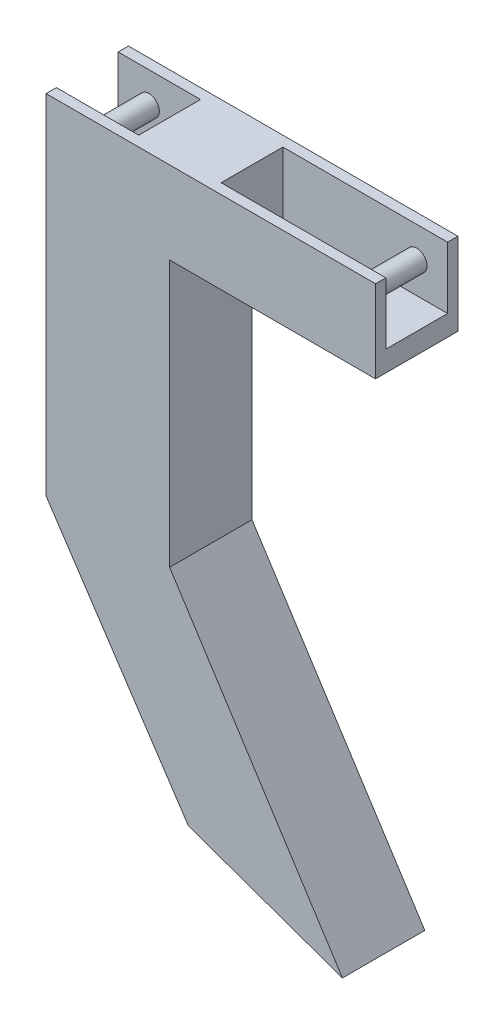
ISO-10303-21;
HEADER;
FILE_DESCRIPTION(('STEP AP214'),'2;1');
FILE_NAME('part.step','',(''),(''),'','','');
FILE_SCHEMA(('AUTOMOTIVE_DESIGN { 1 0 10303 214 1 1 1 1 }'));
ENDSEC;
DATA;
#1=APPLICATION_CONTEXT('core data for automotive mechanical design processes');
#2=APPLICATION_PROTOCOL_DEFINITION('international standard','automotive_design',2000,#1);
#3=PRODUCT_CONTEXT('',#1,'mechanical');
#4=PRODUCT('Part','Part','',(#3));
#5=PRODUCT_RELATED_PRODUCT_CATEGORY('part','',(#4));
#6=PRODUCT_DEFINITION_FORMATION('','',#4);
#7=PRODUCT_DEFINITION_CONTEXT('part definition',#1,'design');
#8=PRODUCT_DEFINITION('design','',#6,#7);
#9=PRODUCT_DEFINITION_SHAPE('','',#8);
#10=(LENGTH_UNIT() NAMED_UNIT(*) SI_UNIT(.MILLI.,.METRE.));
#11=(NAMED_UNIT(*) PLANE_ANGLE_UNIT() SI_UNIT($,.RADIAN.));
#12=(NAMED_UNIT(*) SI_UNIT($,.STERADIAN.) SOLID_ANGLE_UNIT());
#13=UNCERTAINTY_MEASURE_WITH_UNIT(LENGTH_MEASURE(1.E-05),#10,'distance_accuracy_value','');
#14=(GEOMETRIC_REPRESENTATION_CONTEXT(3) GLOBAL_UNCERTAINTY_ASSIGNED_CONTEXT((#13)) GLOBAL_UNIT_ASSIGNED_CONTEXT((#10,
#11,#12)) REPRESENTATION_CONTEXT('',''));
#15=CARTESIAN_POINT('',(0.,0.,0.));
#16=DIRECTION('',(0.,0.,1.));
#17=DIRECTION('',(1.,0.,0.));
#18=AXIS2_PLACEMENT_3D('',#15,#16,#17);
#19=CARTESIAN_POINT('',(26.6666666666667,32.2153846153846,35.));
#20=DIRECTION('',(0.,0.,1.));
#21=DIRECTION('',(1.,0.,0.));
#22=AXIS2_PLACEMENT_3D('',#19,#20,#21);
#23=PLANE('',#22);
#24=DIRECTION('',(1.,0.,0.));
#25=VECTOR('',#24,1.);
#26=CARTESIAN_POINT('',(26.6666666666667,62.2153846153846,35.));
#27=LINE('',#26,#25);
#28=CARTESIAN_POINT('',(26.6666666666667,62.2153846153846,35.));
#29=VERTEX_POINT('',#28);
#30=CARTESIAN_POINT('',(106.666666666667,62.2153846153846,35.));
#31=VERTEX_POINT('',#30);
#32=EDGE_CURVE('E169',#29,#31,#27,.T.);
#33=ORIENTED_EDGE('',*,*,#32,.T.);
#34=DIRECTION('',(0.,1.,0.));
#35=VECTOR('',#34,1.);
#36=CARTESIAN_POINT('',(106.666666666667,32.2153846153846,35.));
#37=LINE('',#36,#35);
#38=CARTESIAN_POINT('',(106.666666666667,32.2153846153846,35.));
#39=VERTEX_POINT('',#38);
#40=EDGE_CURVE('E195',#39,#31,#37,.T.);
#41=ORIENTED_EDGE('',*,*,#40,.F.);
#42=DIRECTION('',(1.,0.,0.));
#43=VECTOR('',#42,1.);
#44=CARTESIAN_POINT('',(26.6666666666667,32.2153846153846,35.));
#45=LINE('',#44,#43);
#46=CARTESIAN_POINT('',(26.6666666666667,32.2153846153846,35.));
#47=VERTEX_POINT('',#46);
#48=EDGE_CURVE('E166',#47,#39,#45,.T.);
#49=ORIENTED_EDGE('',*,*,#48,.F.);
#50=DIRECTION('',(0.,1.,0.));
#51=VECTOR('',#50,1.);
#52=CARTESIAN_POINT('',(26.6666666666667,32.2153846153846,35.));
#53=LINE('',#52,#51);
#54=EDGE_CURVE('E176',#47,#29,#53,.T.);
#55=ORIENTED_EDGE('',*,*,#54,.T.);
#56=EDGE_LOOP('',(#33,#41,#49,#55));
#57=FACE_BOUND('',#56,.T.);
#58=CARTESIAN_POINT('',(91.6666666666667,47.2153846153846,35.));
#59=DIRECTION('',(0.,0.,1.));
#60=DIRECTION('',(1.,0.,0.));
#61=AXIS2_PLACEMENT_3D('',#58,#59,#60);
#62=CIRCLE('',#61,5.00000000000001);
#63=CARTESIAN_POINT('',(96.6666666666667,47.2153846153846,35.));
#64=VERTEX_POINT('',#63);
#65=EDGE_CURVE('E11',#64,#64,#62,.F.);
#66=ORIENTED_EDGE('',*,*,#65,.F.);
#67=EDGE_LOOP('',(#66));
#68=FACE_BOUND('',#67,.T.);
#69=ADVANCED_FACE('F38',(#57,#68),#23,.F.);
#70=CARTESIAN_POINT('',(26.6666666666667,32.2153846153846,5.));
#71=DIRECTION('',(0.,0.,-1.));
#72=DIRECTION('',(-1.,0.,0.));
#73=AXIS2_PLACEMENT_3D('',#70,#71,#72);
#74=PLANE('',#73);
#75=DIRECTION('',(-1.,0.,0.));
#76=VECTOR('',#75,1.);
#77=CARTESIAN_POINT('',(26.6666666666667,62.2153846153846,5.));
#78=LINE('',#77,#76);
#79=CARTESIAN_POINT('',(106.666666666667,62.2153846153846,5.));
#80=VERTEX_POINT('',#79);
#81=CARTESIAN_POINT('',(26.6666666666667,62.2153846153846,5.));
#82=VERTEX_POINT('',#81);
#83=EDGE_CURVE('E368',#80,#82,#78,.T.);
#84=ORIENTED_EDGE('',*,*,#83,.T.);
#85=DIRECTION('',(0.,1.,0.));
#86=VECTOR('',#85,1.);
#87=CARTESIAN_POINT('',(26.6666666666667,32.2153846153846,5.));
#88=LINE('',#87,#86);
#89=CARTESIAN_POINT('',(26.6666666666667,32.2153846153846,5.));
#90=VERTEX_POINT('',#89);
#91=EDGE_CURVE('E155',#90,#82,#88,.T.);
#92=ORIENTED_EDGE('',*,*,#91,.F.);
#93=DIRECTION('',(-1.,0.,0.));
#94=VECTOR('',#93,1.);
#95=CARTESIAN_POINT('',(26.6666666666667,32.2153846153846,5.));
#96=LINE('',#95,#94);
#97=CARTESIAN_POINT('',(106.666666666667,32.2153846153846,5.));
#98=VERTEX_POINT('',#97);
#99=EDGE_CURVE('E151',#98,#90,#96,.T.);
#100=ORIENTED_EDGE('',*,*,#99,.F.);
#101=DIRECTION('',(0.,1.,0.));
#102=VECTOR('',#101,1.);
#103=CARTESIAN_POINT('',(106.666666666667,32.2153846153846,5.));
#104=LINE('',#103,#102);
#105=EDGE_CURVE('E53',#98,#80,#104,.T.);
#106=ORIENTED_EDGE('',*,*,#105,.T.);
#107=EDGE_LOOP('',(#84,#92,#100,#106));
#108=FACE_BOUND('',#107,.T.);
#109=CARTESIAN_POINT('',(91.6666666666667,47.2153846153846,5.));
#110=DIRECTION('',(0.,0.,-1.));
#111=DIRECTION('',(-1.,0.,0.));
#112=AXIS2_PLACEMENT_3D('',#109,#110,#111);
#113=CIRCLE('',#112,5.00000000000001);
#114=CARTESIAN_POINT('',(86.6666666666667,47.2153846153846,5.));
#115=VERTEX_POINT('',#114);
#116=EDGE_CURVE('E46',#115,#115,#113,.F.);
#117=ORIENTED_EDGE('',*,*,#116,.F.);
#118=EDGE_LOOP('',(#117));
#119=FACE_BOUND('',#118,.T.);
#120=ADVANCED_FACE('F153',(#108,#119),#74,.F.);
#121=CARTESIAN_POINT('',(-53.3333333333333,32.2153846153846,35.));
#122=DIRECTION('',(0.,0.,1.));
#123=DIRECTION('',(1.,0.,0.));
#124=AXIS2_PLACEMENT_3D('',#121,#122,#123);
#125=PLANE('',#124);
#126=DIRECTION('',(1.,0.,0.));
#127=VECTOR('',#126,1.);
#128=CARTESIAN_POINT('',(-53.3333333333333,62.2153846153846,35.));
#129=LINE('',#128,#127);
#130=CARTESIAN_POINT('',(-53.3333333333333,62.2153846153846,35.));
#131=VERTEX_POINT('',#130);
#132=CARTESIAN_POINT('',(-13.3333333333333,62.2153846153846,35.));
#133=VERTEX_POINT('',#132);
#134=EDGE_CURVE('E183',#131,#133,#129,.T.);
#135=ORIENTED_EDGE('',*,*,#134,.T.);
#136=DIRECTION('',(0.,1.,0.));
#137=VECTOR('',#136,1.);
#138=CARTESIAN_POINT('',(-13.3333333333333,32.2153846153846,35.));
#139=LINE('',#138,#137);
#140=CARTESIAN_POINT('',(-13.3333333333333,32.2153846153846,35.));
#141=VERTEX_POINT('',#140);
#142=EDGE_CURVE('E199',#141,#133,#139,.T.);
#143=ORIENTED_EDGE('',*,*,#142,.F.);
#144=DIRECTION('',(1.,0.,0.));
#145=VECTOR('',#144,1.);
#146=CARTESIAN_POINT('',(-53.3333333333333,32.2153846153846,35.));
#147=LINE('',#146,#145);
#148=CARTESIAN_POINT('',(-53.3333333333333,32.2153846153846,35.));
#149=VERTEX_POINT('',#148);
#150=EDGE_CURVE('E187',#149,#141,#147,.T.);
#151=ORIENTED_EDGE('',*,*,#150,.F.);
#152=DIRECTION('',(0.,1.,0.));
#153=VECTOR('',#152,1.);
#154=CARTESIAN_POINT('',(-53.3333333333333,32.2153846153846,35.));
#155=LINE('',#154,#153);
#156=EDGE_CURVE('E202',#149,#131,#155,.T.);
#157=ORIENTED_EDGE('',*,*,#156,.T.);
#158=EDGE_LOOP('',(#135,#143,#151,#157));
#159=FACE_BOUND('',#158,.T.);
#160=CARTESIAN_POINT('',(-38.3333333333333,47.2153846153846,35.));
#161=DIRECTION('',(0.,0.,1.));
#162=DIRECTION('',(1.,0.,0.));
#163=AXIS2_PLACEMENT_3D('',#160,#161,#162);
#164=CIRCLE('',#163,5.);
#165=CARTESIAN_POINT('',(-33.3333333333333,47.2153846153846,35.));
#166=VERTEX_POINT('',#165);
#167=EDGE_CURVE('E270',#166,#166,#164,.F.);
#168=ORIENTED_EDGE('',*,*,#167,.F.);
#169=EDGE_LOOP('',(#168));
#170=FACE_BOUND('',#169,.T.);
#171=ADVANCED_FACE('F277',(#159,#170),#125,.F.);
#172=CARTESIAN_POINT('',(-53.3333333333333,32.2153846153846,5.00000000000001));
#173=DIRECTION('',(0.,0.,-1.));
#174=DIRECTION('',(-1.,0.,0.));
#175=AXIS2_PLACEMENT_3D('',#172,#173,#174);
#176=PLANE('',#175);
#177=DIRECTION('',(-1.,0.,0.));
#178=VECTOR('',#177,1.);
#179=CARTESIAN_POINT('',(-53.3333333333333,62.2153846153846,5.00000000000001));
#180=LINE('',#179,#178);
#181=CARTESIAN_POINT('',(-13.3333333333333,62.2153846153846,5.00000000000001));
#182=VERTEX_POINT('',#181);
#183=CARTESIAN_POINT('',(-53.3333333333333,62.2153846153846,5.00000000000001));
#184=VERTEX_POINT('',#183);
#185=EDGE_CURVE('E194',#182,#184,#180,.T.);
#186=ORIENTED_EDGE('',*,*,#185,.T.);
#187=DIRECTION('',(0.,1.,0.));
#188=VECTOR('',#187,1.);
#189=CARTESIAN_POINT('',(-53.3333333333333,32.2153846153846,5.00000000000001));
#190=LINE('',#189,#188);
#191=CARTESIAN_POINT('',(-53.3333333333333,32.2153846153846,5.00000000000001));
#192=VERTEX_POINT('',#191);
#193=EDGE_CURVE('E204',#192,#184,#190,.T.);
#194=ORIENTED_EDGE('',*,*,#193,.F.);
#195=DIRECTION('',(-1.,0.,0.));
#196=VECTOR('',#195,1.);
#197=CARTESIAN_POINT('',(-53.3333333333333,32.2153846153846,5.00000000000001));
#198=LINE('',#197,#196);
#199=CARTESIAN_POINT('',(-13.3333333333333,32.2153846153846,5.00000000000001));
#200=VERTEX_POINT('',#199);
#201=EDGE_CURVE('E61',#200,#192,#198,.T.);
#202=ORIENTED_EDGE('',*,*,#201,.F.);
#203=DIRECTION('',(0.,1.,0.));
#204=VECTOR('',#203,1.);
#205=CARTESIAN_POINT('',(-13.3333333333333,32.2153846153846,5.00000000000001));
#206=LINE('',#205,#204);
#207=EDGE_CURVE('E190',#200,#182,#206,.T.);
#208=ORIENTED_EDGE('',*,*,#207,.T.);
#209=EDGE_LOOP('',(#186,#194,#202,#208));
#210=FACE_BOUND('',#209,.T.);
#211=CARTESIAN_POINT('',(-38.3333333333333,47.2153846153846,5.00000000000001));
#212=DIRECTION('',(0.,0.,-1.));
#213=DIRECTION('',(-1.,0.,0.));
#214=AXIS2_PLACEMENT_3D('',#211,#212,#213);
#215=CIRCLE('',#214,5.);
#216=CARTESIAN_POINT('',(-43.3333333333333,47.2153846153846,5.00000000000001));
#217=VERTEX_POINT('',#216);
#218=EDGE_CURVE('E267',#217,#217,#215,.F.);
#219=ORIENTED_EDGE('',*,*,#218,.F.);
#220=EDGE_LOOP('',(#219));
#221=FACE_BOUND('',#220,.T.);
#222=ADVANCED_FACE('F283',(#210,#221),#176,.F.);
#223=CARTESIAN_POINT('',(6.66666666666667,22.2153846153846,40.));
#224=DIRECTION('',(0.,1.,0.));
#225=DIRECTION('',(-1.,0.,0.));
#226=AXIS2_PLACEMENT_3D('',#223,#224,#225);
#227=PLANE('',#226);
#228=DIRECTION('',(1.,0.,0.));
#229=VECTOR('',#228,1.);
#230=CARTESIAN_POINT('',(6.66666666666667,22.2153846153846,0.));
#231=LINE('',#230,#229);
#232=CARTESIAN_POINT('',(6.66666666666667,22.2153846153846,0.));
#233=VERTEX_POINT('',#232);
#234=CARTESIAN_POINT('',(106.666666666667,22.2153846153846,0.));
#235=VERTEX_POINT('',#234);
#236=EDGE_CURVE('E201',#233,#235,#231,.T.);
#237=ORIENTED_EDGE('',*,*,#236,.T.);
#238=DIRECTION('',(0.,0.,-1.));
#239=VECTOR('',#238,1.);
#240=CARTESIAN_POINT('',(106.666666666667,22.2153846153846,40.));
#241=LINE('',#240,#239);
#242=CARTESIAN_POINT('',(106.666666666667,22.2153846153846,40.));
#243=VERTEX_POINT('',#242);
#244=EDGE_CURVE('E264',#243,#235,#241,.T.);
#245=ORIENTED_EDGE('',*,*,#244,.F.);
#246=DIRECTION('',(1.,0.,0.));
#247=VECTOR('',#246,1.);
#248=CARTESIAN_POINT('',(6.66666666666667,22.2153846153846,40.));
#249=LINE('',#248,#247);
#250=CARTESIAN_POINT('',(6.66666666666667,22.2153846153846,40.));
#251=VERTEX_POINT('',#250);
#252=EDGE_CURVE('E208',#251,#243,#249,.T.);
#253=ORIENTED_EDGE('',*,*,#252,.F.);
#254=DIRECTION('',(0.,0.,-1.));
#255=VECTOR('',#254,1.);
#256=CARTESIAN_POINT('',(6.66666666666667,22.2153846153846,40.));
#257=LINE('',#256,#255);
#258=EDGE_CURVE('E226',#251,#233,#257,.T.);
#259=ORIENTED_EDGE('',*,*,#258,.T.);
#260=EDGE_LOOP('',(#237,#245,#253,#259));
#261=FACE_BOUND('',#260,.T.);
#262=ADVANCED_FACE('F40',(#261),#227,.F.);
#263=CARTESIAN_POINT('',(106.666666666667,22.2153846153846,40.));
#264=DIRECTION('',(-1.,0.,0.));
#265=DIRECTION('',(0.,0.,1.));
#266=AXIS2_PLACEMENT_3D('',#263,#264,#265);
#267=PLANE('',#266);
#268=DIRECTION('',(0.,0.,-1.));
#269=VECTOR('',#268,1.);
#270=CARTESIAN_POINT('',(106.666666666667,32.2153846153846,5.));
#271=LINE('',#270,#269);
#272=EDGE_CURVE('E160',#39,#98,#271,.T.);
#273=ORIENTED_EDGE('',*,*,#272,.F.);
#274=ORIENTED_EDGE('',*,*,#40,.T.);
#275=DIRECTION('',(0.,0.,-1.));
#276=VECTOR('',#275,1.);
#277=CARTESIAN_POINT('',(106.666666666667,62.2153846153846,40.));
#278=LINE('',#277,#276);
#279=CARTESIAN_POINT('',(106.666666666667,62.2153846153846,40.));
#280=VERTEX_POINT('',#279);
#281=EDGE_CURVE('E261',#280,#31,#278,.T.);
#282=ORIENTED_EDGE('',*,*,#281,.F.);
#283=DIRECTION('',(0.,1.,0.));
#284=VECTOR('',#283,1.);
#285=CARTESIAN_POINT('',(106.666666666667,22.2153846153846,40.));
#286=LINE('',#285,#284);
#287=EDGE_CURVE('E211',#243,#280,#286,.T.);
#288=ORIENTED_EDGE('',*,*,#287,.F.);
#289=ORIENTED_EDGE('',*,*,#244,.T.);
#290=DIRECTION('',(0.,1.,0.));
#291=VECTOR('',#290,1.);
#292=CARTESIAN_POINT('',(106.666666666667,22.2153846153846,0.));
#293=LINE('',#292,#291);
#294=CARTESIAN_POINT('',(106.666666666667,62.2153846153846,0.));
#295=VERTEX_POINT('',#294);
#296=EDGE_CURVE('E229',#235,#295,#293,.T.);
#297=ORIENTED_EDGE('',*,*,#296,.T.);
#298=EDGE_CURVE('E174',#80,#295,#278,.T.);
#299=ORIENTED_EDGE('',*,*,#298,.F.);
#300=ORIENTED_EDGE('',*,*,#105,.F.);
#301=EDGE_LOOP('',(#273,#274,#282,#288,#289,#297,#299,#300));
#302=FACE_BOUND('',#301,.T.);
#303=ADVANCED_FACE('F172',(#302),#267,.F.);
#304=CARTESIAN_POINT('',(106.666666666667,62.2153846153846,40.));
#305=DIRECTION('',(0.,-1.,0.));
#306=DIRECTION('',(1.,0.,0.));
#307=AXIS2_PLACEMENT_3D('',#304,#305,#306);
#308=PLANE('',#307);
#309=ORIENTED_EDGE('',*,*,#281,.T.);
#310=ORIENTED_EDGE('',*,*,#32,.F.);
#311=DIRECTION('',(0.,0.,1.));
#312=VECTOR('',#311,1.);
#313=CARTESIAN_POINT('',(26.6666666666667,62.2153846153846,5.));
#314=LINE('',#313,#312);
#315=EDGE_CURVE('E371',#82,#29,#314,.T.);
#316=ORIENTED_EDGE('',*,*,#315,.F.);
#317=ORIENTED_EDGE('',*,*,#83,.F.);
#318=ORIENTED_EDGE('',*,*,#298,.T.);
#319=DIRECTION('',(-1.,0.,0.));
#320=VECTOR('',#319,1.);
#321=CARTESIAN_POINT('',(106.666666666667,62.2153846153846,0.));
#322=LINE('',#321,#320);
#323=CARTESIAN_POINT('',(-53.3333333333333,62.2153846153846,0.));
#324=VERTEX_POINT('',#323);
#325=EDGE_CURVE('E231',#295,#324,#322,.T.);
#326=ORIENTED_EDGE('',*,*,#325,.T.);
#327=DIRECTION('',(0.,0.,-1.));
#328=VECTOR('',#327,1.);
#329=CARTESIAN_POINT('',(-53.3333333333333,62.2153846153846,40.));
#330=LINE('',#329,#328);
#331=EDGE_CURVE('E257',#184,#324,#330,.T.);
#332=ORIENTED_EDGE('',*,*,#331,.F.);
#333=ORIENTED_EDGE('',*,*,#185,.F.);
#334=DIRECTION('',(0.,0.,-1.));
#335=VECTOR('',#334,1.);
#336=CARTESIAN_POINT('',(-13.3333333333333,62.2153846153846,5.00000000000001));
#337=LINE('',#336,#335);
#338=EDGE_CURVE('E191',#133,#182,#337,.T.);
#339=ORIENTED_EDGE('',*,*,#338,.F.);
#340=ORIENTED_EDGE('',*,*,#134,.F.);
#341=CARTESIAN_POINT('',(-53.3333333333333,62.2153846153846,40.));
#342=VERTEX_POINT('',#341);
#343=EDGE_CURVE('E258',#342,#131,#330,.T.);
#344=ORIENTED_EDGE('',*,*,#343,.F.);
#345=DIRECTION('',(-1.,0.,0.));
#346=VECTOR('',#345,1.);
#347=CARTESIAN_POINT('',(106.666666666667,62.2153846153846,40.));
#348=LINE('',#347,#346);
#349=EDGE_CURVE('E214',#280,#342,#348,.T.);
#350=ORIENTED_EDGE('',*,*,#349,.F.);
#351=EDGE_LOOP('',(#309,#310,#316,#317,#318,#326,#332,#333,#339,#340,#344,#350));
#352=FACE_BOUND('',#351,.T.);
#353=ADVANCED_FACE('F332',(#352),#308,.F.);
#354=CARTESIAN_POINT('',(-53.3333333333333,62.2153846153846,40.));
#355=DIRECTION('',(1.,0.,0.));
#356=DIRECTION('',(0.,1.,0.));
#357=AXIS2_PLACEMENT_3D('',#354,#355,#356);
#358=PLANE('',#357);
#359=ORIENTED_EDGE('',*,*,#343,.T.);
#360=ORIENTED_EDGE('',*,*,#156,.F.);
#361=DIRECTION('',(0.,0.,1.));
#362=VECTOR('',#361,1.);
#363=CARTESIAN_POINT('',(-53.3333333333333,32.2153846153846,5.00000000000001));
#364=LINE('',#363,#362);
#365=EDGE_CURVE('E185',#192,#149,#364,.T.);
#366=ORIENTED_EDGE('',*,*,#365,.F.);
#367=ORIENTED_EDGE('',*,*,#193,.T.);
#368=ORIENTED_EDGE('',*,*,#331,.T.);
#369=DIRECTION('',(0.,-1.,0.));
#370=VECTOR('',#369,1.);
#371=CARTESIAN_POINT('',(-53.3333333333333,62.2153846153846,0.));
#372=LINE('',#371,#370);
#373=CARTESIAN_POINT('',(-53.3333333333333,-107.008547008547,0.));
#374=VERTEX_POINT('',#373);
#375=EDGE_CURVE('E234',#324,#374,#372,.T.);
#376=ORIENTED_EDGE('',*,*,#375,.T.);
#377=DIRECTION('',(0.,0.,-1.));
#378=VECTOR('',#377,1.);
#379=CARTESIAN_POINT('',(-53.3333333333333,-107.008547008547,40.));
#380=LINE('',#379,#378);
#381=CARTESIAN_POINT('',(-53.3333333333333,-107.008547008547,40.));
#382=VERTEX_POINT('',#381);
#383=EDGE_CURVE('E254',#382,#374,#380,.T.);
#384=ORIENTED_EDGE('',*,*,#383,.F.);
#385=DIRECTION('',(0.,-1.,0.));
#386=VECTOR('',#385,1.);
#387=CARTESIAN_POINT('',(-53.3333333333333,62.2153846153846,40.));
#388=LINE('',#387,#386);
#389=EDGE_CURVE('E216',#342,#382,#388,.T.);
#390=ORIENTED_EDGE('',*,*,#389,.F.);
#391=EDGE_LOOP('',(#359,#360,#366,#367,#368,#376,#384,#390));
#392=FACE_BOUND('',#391,.T.);
#393=ADVANCED_FACE('F328',(#392),#358,.F.);
#394=CARTESIAN_POINT('',(-53.3333333333333,-107.008547008547,40.));
#395=DIRECTION('',(0.833427692085293,0.552628520857711,0.));
#396=DIRECTION('',(-0.552628520857711,0.833427692085293,0.));
#397=AXIS2_PLACEMENT_3D('',#394,#395,#396);
#398=PLANE('',#397);
#399=DIRECTION('',(0.552628520857711,-0.833427692085293,0.));
#400=VECTOR('',#399,1.);
#401=CARTESIAN_POINT('',(-53.3333333333333,-107.008547008547,0.));
#402=LINE('',#401,#400);
#403=CARTESIAN_POINT('',(15.7538461538461,-211.2,0.));
#404=VERTEX_POINT('',#403);
#405=EDGE_CURVE('E236',#374,#404,#402,.T.);
#406=ORIENTED_EDGE('',*,*,#405,.T.);
#407=DIRECTION('',(0.,0.,-1.));
#408=VECTOR('',#407,1.);
#409=CARTESIAN_POINT('',(15.7538461538461,-211.2,40.));
#410=LINE('',#409,#408);
#411=CARTESIAN_POINT('',(15.7538461538461,-211.2,40.));
#412=VERTEX_POINT('',#411);
#413=EDGE_CURVE('E251',#412,#404,#410,.T.);
#414=ORIENTED_EDGE('',*,*,#413,.F.);
#415=DIRECTION('',(0.552628520857711,-0.833427692085293,0.));
#416=VECTOR('',#415,1.);
#417=CARTESIAN_POINT('',(-53.3333333333333,-107.008547008547,40.));
#418=LINE('',#417,#416);
#419=EDGE_CURVE('E218',#382,#412,#418,.T.);
#420=ORIENTED_EDGE('',*,*,#419,.F.);
#421=ORIENTED_EDGE('',*,*,#383,.T.);
#422=EDGE_LOOP('',(#406,#414,#420,#421));
#423=FACE_BOUND('',#422,.T.);
#424=ADVANCED_FACE('F324',(#423),#398,.F.);
#425=CARTESIAN_POINT('',(15.7538461538461,-211.2,40.));
#426=DIRECTION('',(0.334765052352706,0.942301628844655,0.));
#427=DIRECTION('',(-0.942301628844655,0.334765052352706,0.));
#428=AXIS2_PLACEMENT_3D('',#425,#426,#427);
#429=PLANE('',#428);
#430=DIRECTION('',(0.942301628844655,-0.334765052352706,0.));
#431=VECTOR('',#430,1.);
#432=CARTESIAN_POINT('',(15.7538461538461,-211.2,0.));
#433=LINE('',#432,#431);
#434=CARTESIAN_POINT('',(90.5846153846154,-237.784615384615,0.));
#435=VERTEX_POINT('',#434);
#436=EDGE_CURVE('E238',#404,#435,#433,.T.);
#437=ORIENTED_EDGE('',*,*,#436,.T.);
#438=DIRECTION('',(0.,0.,-1.));
#439=VECTOR('',#438,1.);
#440=CARTESIAN_POINT('',(90.5846153846154,-237.784615384615,40.));
#441=LINE('',#440,#439);
#442=CARTESIAN_POINT('',(90.5846153846154,-237.784615384615,40.));
#443=VERTEX_POINT('',#442);
#444=EDGE_CURVE('E248',#443,#435,#441,.T.);
#445=ORIENTED_EDGE('',*,*,#444,.F.);
#446=DIRECTION('',(0.942301628844655,-0.334765052352706,0.));
#447=VECTOR('',#446,1.);
#448=CARTESIAN_POINT('',(15.7538461538461,-211.2,40.));
#449=LINE('',#448,#447);
#450=EDGE_CURVE('E220',#412,#443,#449,.T.);
#451=ORIENTED_EDGE('',*,*,#450,.F.);
#452=ORIENTED_EDGE('',*,*,#413,.T.);
#453=EDGE_LOOP('',(#437,#445,#451,#452));
#454=FACE_BOUND('',#453,.T.);
#455=ADVANCED_FACE('F320',(#454),#429,.F.);
#456=CARTESIAN_POINT('',(90.5846153846154,-237.784615384615,40.));
#457=DIRECTION('',(-0.84162426781718,-0.540063507211139,0.));
#458=DIRECTION('',(0.540063507211139,-0.84162426781718,0.));
#459=AXIS2_PLACEMENT_3D('',#456,#457,#458);
#460=PLANE('',#459);
#461=DIRECTION('',(-0.540063507211139,0.84162426781718,0.));
#462=VECTOR('',#461,1.);
#463=CARTESIAN_POINT('',(90.5846153846154,-237.784615384615,0.));
#464=LINE('',#463,#462);
#465=CARTESIAN_POINT('',(6.66666666666667,-107.008547008547,0.));
#466=VERTEX_POINT('',#465);
#467=EDGE_CURVE('E240',#435,#466,#464,.T.);
#468=ORIENTED_EDGE('',*,*,#467,.T.);
#469=DIRECTION('',(0.,0.,-1.));
#470=VECTOR('',#469,1.);
#471=CARTESIAN_POINT('',(6.66666666666667,-107.008547008547,40.));
#472=LINE('',#471,#470);
#473=CARTESIAN_POINT('',(6.66666666666667,-107.008547008547,40.));
#474=VERTEX_POINT('',#473);
#475=EDGE_CURVE('E245',#474,#466,#472,.T.);
#476=ORIENTED_EDGE('',*,*,#475,.F.);
#477=DIRECTION('',(-0.540063507211139,0.84162426781718,0.));
#478=VECTOR('',#477,1.);
#479=CARTESIAN_POINT('',(90.5846153846154,-237.784615384615,40.));
#480=LINE('',#479,#478);
#481=EDGE_CURVE('E222',#443,#474,#480,.T.);
#482=ORIENTED_EDGE('',*,*,#481,.F.);
#483=ORIENTED_EDGE('',*,*,#444,.T.);
#484=EDGE_LOOP('',(#468,#476,#482,#483));
#485=FACE_BOUND('',#484,.T.);
#486=ADVANCED_FACE('F316',(#485),#460,.F.);
#487=CARTESIAN_POINT('',(6.66666666666667,-107.008547008547,40.));
#488=DIRECTION('',(-1.,0.,0.));
#489=DIRECTION('',(0.,0.,1.));
#490=AXIS2_PLACEMENT_3D('',#487,#488,#489);
#491=PLANE('',#490);
#492=DIRECTION('',(0.,1.,0.));
#493=VECTOR('',#492,1.);
#494=CARTESIAN_POINT('',(6.66666666666667,-107.008547008547,0.));
#495=LINE('',#494,#493);
#496=EDGE_CURVE('E212',#466,#233,#495,.T.);
#497=ORIENTED_EDGE('',*,*,#496,.T.);
#498=ORIENTED_EDGE('',*,*,#258,.F.);
#499=DIRECTION('',(0.,1.,0.));
#500=VECTOR('',#499,1.);
#501=CARTESIAN_POINT('',(6.66666666666667,-107.008547008547,40.));
#502=LINE('',#501,#500);
#503=EDGE_CURVE('E224',#474,#251,#502,.T.);
#504=ORIENTED_EDGE('',*,*,#503,.F.);
#505=ORIENTED_EDGE('',*,*,#475,.T.);
#506=EDGE_LOOP('',(#497,#498,#504,#505));
#507=FACE_BOUND('',#506,.T.);
#508=ADVANCED_FACE('F309',(#507),#491,.F.);
#509=CARTESIAN_POINT('',(0.,0.,40.));
#510=DIRECTION('',(0.,0.,1.));
#511=DIRECTION('',(1.,0.,0.));
#512=AXIS2_PLACEMENT_3D('',#509,#510,#511);
#513=PLANE('',#512);
#514=ORIENTED_EDGE('',*,*,#252,.T.);
#515=ORIENTED_EDGE('',*,*,#287,.T.);
#516=ORIENTED_EDGE('',*,*,#349,.T.);
#517=ORIENTED_EDGE('',*,*,#389,.T.);
#518=ORIENTED_EDGE('',*,*,#419,.T.);
#519=ORIENTED_EDGE('',*,*,#450,.T.);
#520=ORIENTED_EDGE('',*,*,#481,.T.);
#521=ORIENTED_EDGE('',*,*,#503,.T.);
#522=EDGE_LOOP('',(#514,#515,#516,#517,#518,#519,#520,#521));
#523=FACE_BOUND('',#522,.T.);
#524=ADVANCED_FACE('F306',(#523),#513,.T.);
#525=CARTESIAN_POINT('',(0.,0.,0.));
#526=DIRECTION('',(0.,0.,1.));
#527=DIRECTION('',(1.,0.,0.));
#528=AXIS2_PLACEMENT_3D('',#525,#526,#527);
#529=PLANE('',#528);
#530=ORIENTED_EDGE('',*,*,#236,.F.);
#531=ORIENTED_EDGE('',*,*,#496,.F.);
#532=ORIENTED_EDGE('',*,*,#467,.F.);
#533=ORIENTED_EDGE('',*,*,#436,.F.);
#534=ORIENTED_EDGE('',*,*,#405,.F.);
#535=ORIENTED_EDGE('',*,*,#375,.F.);
#536=ORIENTED_EDGE('',*,*,#325,.F.);
#537=ORIENTED_EDGE('',*,*,#296,.F.);
#538=EDGE_LOOP('',(#530,#531,#532,#533,#534,#535,#536,#537));
#539=FACE_BOUND('',#538,.T.);
#540=ADVANCED_FACE('F304',(#539),#529,.F.);
#541=CARTESIAN_POINT('',(-13.3333333333333,32.2153846153846,5.00000000000001));
#542=DIRECTION('',(1.,0.,0.));
#543=DIRECTION('',(0.,1.,0.));
#544=AXIS2_PLACEMENT_3D('',#541,#542,#543);
#545=PLANE('',#544);
#546=ORIENTED_EDGE('',*,*,#338,.T.);
#547=ORIENTED_EDGE('',*,*,#207,.F.);
#548=DIRECTION('',(0.,0.,-1.));
#549=VECTOR('',#548,1.);
#550=CARTESIAN_POINT('',(-13.3333333333333,32.2153846153846,5.00000000000001));
#551=LINE('',#550,#549);
#552=EDGE_CURVE('E181',#141,#200,#551,.T.);
#553=ORIENTED_EDGE('',*,*,#552,.F.);
#554=ORIENTED_EDGE('',*,*,#142,.T.);
#555=EDGE_LOOP('',(#546,#547,#553,#554));
#556=FACE_BOUND('',#555,.T.);
#557=ADVANCED_FACE('F297',(#556),#545,.F.);
#558=CARTESIAN_POINT('',(0.,32.2153846153846,0.));
#559=DIRECTION('',(0.,1.,0.));
#560=DIRECTION('',(-1.,0.,0.));
#561=AXIS2_PLACEMENT_3D('',#558,#559,#560);
#562=PLANE('',#561);
#563=ORIENTED_EDGE('',*,*,#552,.T.);
#564=ORIENTED_EDGE('',*,*,#201,.T.);
#565=ORIENTED_EDGE('',*,*,#365,.T.);
#566=ORIENTED_EDGE('',*,*,#150,.T.);
#567=EDGE_LOOP('',(#563,#564,#565,#566));
#568=FACE_BOUND('',#567,.T.);
#569=ADVANCED_FACE('F294',(#568),#562,.T.);
#570=CARTESIAN_POINT('',(-38.3333333333333,47.2153846153846,35.));
#571=DIRECTION('',(0.,0.,-1.));
#572=DIRECTION('',(-1.,0.,0.));
#573=AXIS2_PLACEMENT_3D('',#570,#571,#572);
#574=CYLINDRICAL_SURFACE('',#573,5.);
#575=ORIENTED_EDGE('',*,*,#167,.T.);
#576=EDGE_LOOP('',(#575));
#577=FACE_BOUND('',#576,.T.);
#578=ORIENTED_EDGE('',*,*,#218,.T.);
#579=EDGE_LOOP('',(#578));
#580=FACE_BOUND('',#579,.T.);
#581=ADVANCED_FACE('F291',(#577,#580),#574,.T.);
#582=CARTESIAN_POINT('',(26.6666666666667,32.2153846153846,5.));
#583=DIRECTION('',(-1.,0.,0.));
#584=DIRECTION('',(0.,-1.,0.));
#585=AXIS2_PLACEMENT_3D('',#582,#583,#584);
#586=PLANE('',#585);
#587=ORIENTED_EDGE('',*,*,#315,.T.);
#588=ORIENTED_EDGE('',*,*,#54,.F.);
#589=DIRECTION('',(0.,0.,1.));
#590=VECTOR('',#589,1.);
#591=CARTESIAN_POINT('',(26.6666666666667,32.2153846153846,5.));
#592=LINE('',#591,#590);
#593=EDGE_CURVE('E159',#90,#47,#592,.T.);
#594=ORIENTED_EDGE('',*,*,#593,.F.);
#595=ORIENTED_EDGE('',*,*,#91,.T.);
#596=EDGE_LOOP('',(#587,#588,#594,#595));
#597=FACE_BOUND('',#596,.T.);
#598=ADVANCED_FACE('F290',(#597),#586,.F.);
#599=CARTESIAN_POINT('',(0.,32.2153846153846,0.));
#600=DIRECTION('',(0.,1.,0.));
#601=DIRECTION('',(-1.,0.,0.));
#602=AXIS2_PLACEMENT_3D('',#599,#600,#601);
#603=PLANE('',#602);
#604=ORIENTED_EDGE('',*,*,#272,.T.);
#605=ORIENTED_EDGE('',*,*,#99,.T.);
#606=ORIENTED_EDGE('',*,*,#593,.T.);
#607=ORIENTED_EDGE('',*,*,#48,.T.);
#608=EDGE_LOOP('',(#604,#605,#606,#607));
#609=FACE_BOUND('',#608,.T.);
#610=ADVANCED_FACE('F164',(#609),#603,.T.);
#611=CARTESIAN_POINT('',(91.6666666666667,47.2153846153846,35.));
#612=DIRECTION('',(0.,0.,-1.));
#613=DIRECTION('',(-1.,0.,0.));
#614=AXIS2_PLACEMENT_3D('',#611,#612,#613);
#615=CYLINDRICAL_SURFACE('',#614,5.00000000000001);
#616=ORIENTED_EDGE('',*,*,#65,.T.);
#617=EDGE_LOOP('',(#616));
#618=FACE_BOUND('',#617,.T.);
#619=ORIENTED_EDGE('',*,*,#116,.T.);
#620=EDGE_LOOP('',(#619));
#621=FACE_BOUND('',#620,.T.);
#622=ADVANCED_FACE('F275',(#618,#621),#615,.T.);
#623=CLOSED_SHELL('',(#69,#120,#171,#222,#262,#303,#353,#393,#424,#455,#486,#508,#524,#540,#557,
#569,#581,#598,#610,#622));
#624=MANIFOLD_SOLID_BREP('B2',#623);
#625=ADVANCED_BREP_SHAPE_REPRESENTATION('',(#18,#624),#14);
#626=SHAPE_DEFINITION_REPRESENTATION(#9,#625);
ENDSEC;
END-ISO-10303-21;
